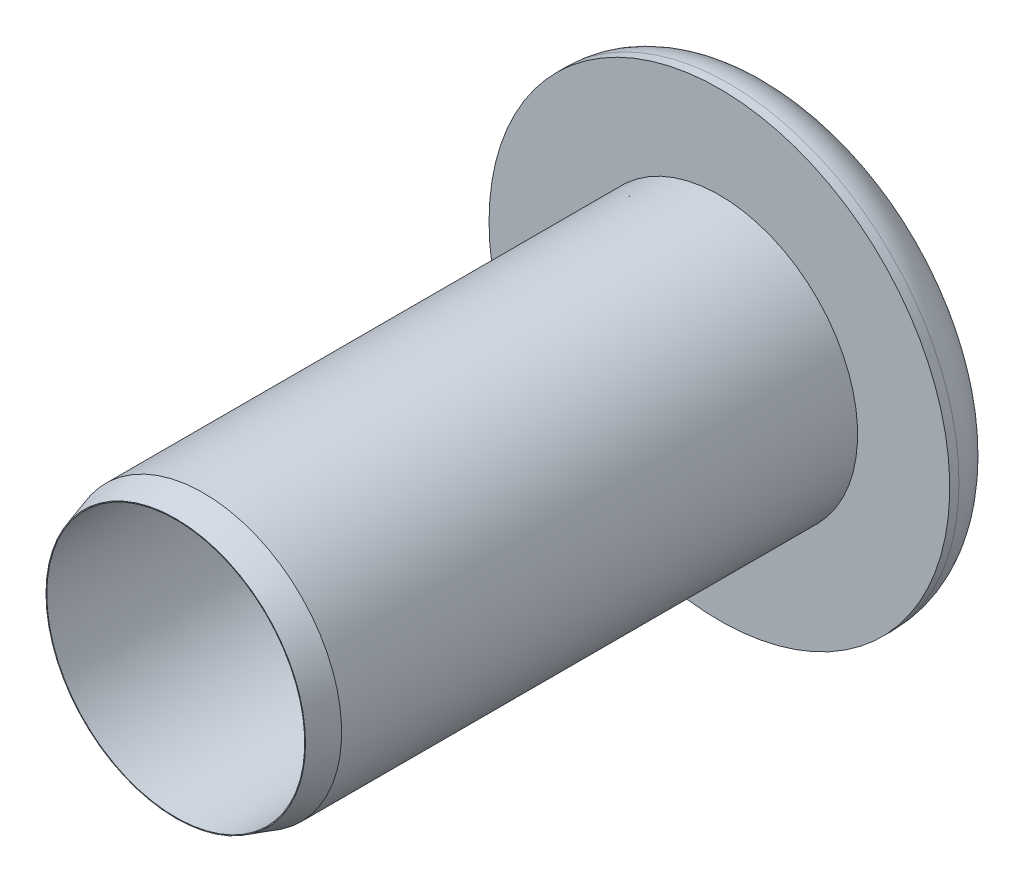
ISO-10303-21;
HEADER;
FILE_DESCRIPTION(('STEP AP214'),'2;1');
FILE_NAME('part.step','',(''),(''),'','','');
FILE_SCHEMA(('AUTOMOTIVE_DESIGN { 1 0 10303 214 1 1 1 1 }'));
ENDSEC;
DATA;
#1=APPLICATION_CONTEXT('core data for automotive mechanical design processes');
#2=APPLICATION_PROTOCOL_DEFINITION('international standard','automotive_design',2000,#1);
#3=PRODUCT_CONTEXT('',#1,'mechanical');
#4=PRODUCT('Part','Part','',(#3));
#5=PRODUCT_RELATED_PRODUCT_CATEGORY('part','',(#4));
#6=PRODUCT_DEFINITION_FORMATION('','',#4);
#7=PRODUCT_DEFINITION_CONTEXT('part definition',#1,'design');
#8=PRODUCT_DEFINITION('design','',#6,#7);
#9=PRODUCT_DEFINITION_SHAPE('','',#8);
#10=(LENGTH_UNIT() NAMED_UNIT(*) SI_UNIT(.MILLI.,.METRE.));
#11=(NAMED_UNIT(*) PLANE_ANGLE_UNIT() SI_UNIT($,.RADIAN.));
#12=(NAMED_UNIT(*) SI_UNIT($,.STERADIAN.) SOLID_ANGLE_UNIT());
#13=UNCERTAINTY_MEASURE_WITH_UNIT(LENGTH_MEASURE(1.E-05),#10,'distance_accuracy_value','');
#14=(GEOMETRIC_REPRESENTATION_CONTEXT(3) GLOBAL_UNCERTAINTY_ASSIGNED_CONTEXT((#13)) GLOBAL_UNIT_ASSIGNED_CONTEXT((#10,
#11,#12)) REPRESENTATION_CONTEXT('',''));
#15=CARTESIAN_POINT('',(0.,0.,0.));
#16=DIRECTION('',(0.,0.,1.));
#17=DIRECTION('',(1.,0.,0.));
#18=AXIS2_PLACEMENT_3D('',#15,#16,#17);
#19=CARTESIAN_POINT('',(0.,0.,6.5));
#20=DIRECTION('',(0.,0.,-1.));
#21=DIRECTION('',(-1.,0.,0.));
#22=AXIS2_PLACEMENT_3D('',#19,#20,#21);
#23=CYLINDRICAL_SURFACE('',#22,1.5);
#24=CARTESIAN_POINT('',(0.,0.,6.20000000000003));
#25=DIRECTION('',(0.,0.,1.));
#26=DIRECTION('',(1.,0.,0.));
#27=AXIS2_PLACEMENT_3D('',#24,#25,#26);
#28=CIRCLE('',#27,1.5);
#29=CARTESIAN_POINT('',(-1.5,0.,6.20000000000003));
#30=VERTEX_POINT('',#29);
#31=EDGE_CURVE('E10',#30,#30,#28,.F.);
#32=CARTESIAN_POINT('',(0.,0.,0.6));
#33=DIRECTION('',(0.,0.,-1.));
#34=DIRECTION('',(-1.,0.,0.));
#35=AXIS2_PLACEMENT_3D('',#32,#33,#34);
#36=CIRCLE('',#35,1.5);
#37=CARTESIAN_POINT('',(-1.5,0.,0.6));
#38=VERTEX_POINT('',#37);
#39=EDGE_CURVE('E57',#38,#38,#36,.T.);
#40=CARTESIAN_POINT('',(-1.5,0.,6.20000000000003));
#41=CARTESIAN_POINT('',(-1.5,0.,6.1416666666667));
#42=CARTESIAN_POINT('',(-1.5,0.,6.08333333333337));
#43=CARTESIAN_POINT('',(-1.5,0.,5.9666666666667));
#44=CARTESIAN_POINT('',(-1.5,0.,5.90833333333337));
#45=CARTESIAN_POINT('',(-1.5,0.,5.7916666666667));
#46=CARTESIAN_POINT('',(-1.5,0.,5.73333333333336));
#47=CARTESIAN_POINT('',(-1.5,0.,5.6166666666667));
#48=CARTESIAN_POINT('',(-1.5,0.,5.55833333333336));
#49=CARTESIAN_POINT('',(-1.5,0.,5.4416666666667));
#50=CARTESIAN_POINT('',(-1.5,0.,5.38333333333336));
#51=CARTESIAN_POINT('',(-1.5,0.,5.26666666666669));
#52=CARTESIAN_POINT('',(-1.5,0.,5.20833333333336));
#53=CARTESIAN_POINT('',(-1.5,0.,5.09166666666669));
#54=CARTESIAN_POINT('',(-1.5,0.,5.03333333333336));
#55=CARTESIAN_POINT('',(-1.5,0.,4.91666666666669));
#56=CARTESIAN_POINT('',(-1.5,0.,4.85833333333336));
#57=CARTESIAN_POINT('',(-1.5,0.,4.74166666666669));
#58=CARTESIAN_POINT('',(-1.5,0.,4.68333333333336));
#59=CARTESIAN_POINT('',(-1.5,0.,4.56666666666669));
#60=CARTESIAN_POINT('',(-1.5,0.,4.50833333333336));
#61=CARTESIAN_POINT('',(-1.5,0.,4.39166666666669));
#62=CARTESIAN_POINT('',(-1.5,0.,4.33333333333336));
#63=CARTESIAN_POINT('',(-1.5,0.,4.21666666666669));
#64=CARTESIAN_POINT('',(-1.5,0.,4.15833333333336));
#65=CARTESIAN_POINT('',(-1.5,0.,4.04166666666669));
#66=CARTESIAN_POINT('',(-1.5,0.,3.98333333333335));
#67=CARTESIAN_POINT('',(-1.5,0.,3.86666666666669));
#68=CARTESIAN_POINT('',(-1.5,0.,3.80833333333335));
#69=CARTESIAN_POINT('',(-1.5,0.,3.69166666666669));
#70=CARTESIAN_POINT('',(-1.5,0.,3.63333333333335));
#71=CARTESIAN_POINT('',(-1.5,0.,3.51666666666668));
#72=CARTESIAN_POINT('',(-1.5,0.,3.45833333333335));
#73=CARTESIAN_POINT('',(-1.5,0.,3.34166666666668));
#74=CARTESIAN_POINT('',(-1.5,0.,3.28333333333335));
#75=CARTESIAN_POINT('',(-1.5,0.,3.16666666666668));
#76=CARTESIAN_POINT('',(-1.5,0.,3.10833333333335));
#77=CARTESIAN_POINT('',(-1.5,0.,2.99166666666668));
#78=CARTESIAN_POINT('',(-1.5,0.,2.93333333333335));
#79=CARTESIAN_POINT('',(-1.5,0.,2.81666666666668));
#80=CARTESIAN_POINT('',(-1.5,0.,2.75833333333335));
#81=CARTESIAN_POINT('',(-1.5,0.,2.64166666666668));
#82=CARTESIAN_POINT('',(-1.5,0.,2.58333333333335));
#83=CARTESIAN_POINT('',(-1.5,0.,2.46666666666668));
#84=CARTESIAN_POINT('',(-1.5,0.,2.40833333333334));
#85=CARTESIAN_POINT('',(-1.5,0.,2.29166666666668));
#86=CARTESIAN_POINT('',(-1.5,0.,2.23333333333334));
#87=CARTESIAN_POINT('',(-1.5,0.,2.11666666666668));
#88=CARTESIAN_POINT('',(-1.5,0.,2.05833333333334));
#89=CARTESIAN_POINT('',(-1.5,0.,1.94166666666667));
#90=CARTESIAN_POINT('',(-1.5,0.,1.88333333333334));
#91=CARTESIAN_POINT('',(-1.5,0.,1.76666666666667));
#92=CARTESIAN_POINT('',(-1.5,0.,1.70833333333334));
#93=CARTESIAN_POINT('',(-1.5,0.,1.59166666666667));
#94=CARTESIAN_POINT('',(-1.5,0.,1.53333333333334));
#95=CARTESIAN_POINT('',(-1.5,0.,1.41666666666667));
#96=CARTESIAN_POINT('',(-1.5,0.,1.35833333333334));
#97=CARTESIAN_POINT('',(-1.5,0.,1.24166666666667));
#98=CARTESIAN_POINT('',(-1.5,0.,1.18333333333334));
#99=CARTESIAN_POINT('',(-1.5,0.,1.06666666666667));
#100=CARTESIAN_POINT('',(-1.5,0.,1.00833333333334));
#101=CARTESIAN_POINT('',(-1.5,0.,0.891666666666668));
#102=CARTESIAN_POINT('',(-1.5,0.,0.833333333333334));
#103=CARTESIAN_POINT('',(-1.5,0.,0.716666666666667));
#104=CARTESIAN_POINT('',(-1.5,0.,0.658333333333333));
#105=CARTESIAN_POINT('',(-1.5,0.,0.6));
#106=B_SPLINE_CURVE_WITH_KNOTS('',3,(#40,#41,#42,#43,#44,#45,#46,#47,#48,#49,#50,#51,#52,#53,
#54,#55,#56,#57,#58,#59,#60,#61,#62,#63,#64,#65,#66,#67,#68,#69,#70,#71,#72,#73,#74,#75,#76,#77,
#78,#79,#80,#81,#82,#83,#84,#85,#86,#87,#88,#89,#90,#91,#92,#93,#94,#95,#96,#97,#98,#99,#100,
#101,#102,#103,#104,#105),.UNSPECIFIED.,.F.,.F.,(4,2,2,2,2,2,2,2,2,2,2,2,2,2,2,2,2,2,2,2,2,2,2,
2,2,2,2,2,2,2,2,2,4),(0.,0.175000000000001,0.350000000000001,0.525000000000003,
0.700000000000004,0.875000000000005,1.05000000000001,1.22500000000001,1.40000000000001,
1.57500000000001,1.75000000000001,1.92500000000001,2.10000000000001,2.27500000000001,
2.45000000000001,2.62500000000002,2.80000000000002,2.97500000000002,3.15000000000002,
3.32500000000002,3.50000000000002,3.67500000000002,3.85000000000002,4.02500000000002,
4.20000000000002,4.37500000000003,4.55000000000003,4.72500000000003,4.90000000000003,
5.07500000000003,5.25000000000003,5.42500000000003,5.60000000000003),.UNSPECIFIED.);
#107=EDGE_CURVE('BSEAM31',#30,#38,#106,.T.);
#108=ORIENTED_EDGE('',*,*,#31,.T.);
#109=ORIENTED_EDGE('',*,*,#39,.F.);
#110=ORIENTED_EDGE('',*,*,#107,.T.);
#111=ORIENTED_EDGE('',*,*,#107,.F.);
#112=EDGE_LOOP('',(#108,#110,#109,#111));
#113=FACE_BOUND('',#112,.T.);
#114=ADVANCED_FACE('F31',(#113),#23,.T.);
#115=CARTESIAN_POINT('',(0.,0.,6.5));
#116=DIRECTION('',(0.,0.,1.));
#117=DIRECTION('',(1.,0.,0.));
#118=AXIS2_PLACEMENT_3D('',#115,#116,#117);
#119=PLANE('',#118);
#120=CARTESIAN_POINT('',(0.,0.,6.5));
#121=DIRECTION('',(0.,0.,1.));
#122=DIRECTION('',(1.,0.,0.));
#123=AXIS2_PLACEMENT_3D('',#120,#121,#122);
#124=CIRCLE('',#123,1.40828079556241);
#125=CARTESIAN_POINT('',(1.40828079556241,0.,6.5));
#126=VERTEX_POINT('',#125);
#127=EDGE_CURVE('E38',#126,#126,#124,.T.);
#128=ORIENTED_EDGE('',*,*,#127,.T.);
#129=EDGE_LOOP('',(#128));
#130=FACE_BOUND('',#129,.T.);
#131=CARTESIAN_POINT('',(0.,0.,6.5));
#132=DIRECTION('',(0.,0.,1.));
#133=DIRECTION('',(1.,0.,0.));
#134=AXIS2_PLACEMENT_3D('',#131,#132,#133);
#135=CIRCLE('',#134,1.4);
#136=CARTESIAN_POINT('',(-1.4,0.,6.5));
#137=VERTEX_POINT('',#136);
#138=EDGE_CURVE('E60',#137,#137,#135,.T.);
#139=ORIENTED_EDGE('',*,*,#138,.F.);
#140=EDGE_LOOP('',(#139));
#141=FACE_BOUND('',#140,.T.);
#142=ADVANCED_FACE('F85',(#130,#141),#119,.T.);
#143=CARTESIAN_POINT('',(0.,0.,0.));
#144=DIRECTION('',(0.,0.,1.));
#145=DIRECTION('',(1.,0.,0.));
#146=AXIS2_PLACEMENT_3D('',#143,#144,#145);
#147=PLANE('',#146);
#148=CARTESIAN_POINT('',(0.,0.,0.));
#149=DIRECTION('',(0.,0.,1.));
#150=DIRECTION('',(1.,0.,0.));
#151=AXIS2_PLACEMENT_3D('',#148,#149,#150);
#152=CIRCLE('',#151,1.9);
#153=CARTESIAN_POINT('',(1.9,0.,0.));
#154=VERTEX_POINT('',#153);
#155=EDGE_CURVE('E51',#154,#154,#152,.T.);
#156=ORIENTED_EDGE('',*,*,#155,.T.);
#157=EDGE_LOOP('',(#156));
#158=FACE_BOUND('',#157,.T.);
#159=CARTESIAN_POINT('',(0.,0.,0.));
#160=DIRECTION('',(0.,0.,1.));
#161=DIRECTION('',(1.,0.,0.));
#162=AXIS2_PLACEMENT_3D('',#159,#160,#161);
#163=CIRCLE('',#162,2.);
#164=CARTESIAN_POINT('',(2.,0.,0.));
#165=VERTEX_POINT('',#164);
#166=EDGE_CURVE('E54',#165,#165,#163,.F.);
#167=ORIENTED_EDGE('',*,*,#166,.T.);
#168=EDGE_LOOP('',(#167));
#169=FACE_BOUND('',#168,.T.);
#170=ADVANCED_FACE('F90',(#158,#169),#147,.F.);
#171=CARTESIAN_POINT('',(0.,0.,6.5));
#172=DIRECTION('',(0.,0.,-1.));
#173=DIRECTION('',(-1.,0.,0.));
#174=AXIS2_PLACEMENT_3D('',#171,#172,#173);
#175=CYLINDRICAL_SURFACE('',#174,1.4);
#176=CARTESIAN_POINT('',(0.,0.,0.5));
#177=DIRECTION('',(0.,0.,1.));
#178=DIRECTION('',(1.,0.,0.));
#179=AXIS2_PLACEMENT_3D('',#176,#177,#178);
#180=CIRCLE('',#179,1.4);
#181=CARTESIAN_POINT('',(-1.4,0.,0.499999999999999));
#182=VERTEX_POINT('',#181);
#183=EDGE_CURVE('E46',#182,#182,#180,.F.);
#184=CARTESIAN_POINT('',(-1.4,0.,0.499999999999999));
#185=CARTESIAN_POINT('',(-1.4,0.,0.562499999999999));
#186=CARTESIAN_POINT('',(-1.4,0.,0.624999999999999));
#187=CARTESIAN_POINT('',(-1.4,0.,0.749999999999999));
#188=CARTESIAN_POINT('',(-1.4,0.,0.812499999999999));
#189=CARTESIAN_POINT('',(-1.4,0.,0.937499999999999));
#190=CARTESIAN_POINT('',(-1.4,0.,0.999999999999999));
#191=CARTESIAN_POINT('',(-1.4,0.,1.125));
#192=CARTESIAN_POINT('',(-1.4,0.,1.1875));
#193=CARTESIAN_POINT('',(-1.4,0.,1.3125));
#194=CARTESIAN_POINT('',(-1.4,0.,1.375));
#195=CARTESIAN_POINT('',(-1.4,0.,1.5));
#196=CARTESIAN_POINT('',(-1.4,0.,1.5625));
#197=CARTESIAN_POINT('',(-1.4,0.,1.6875));
#198=CARTESIAN_POINT('',(-1.4,0.,1.75));
#199=CARTESIAN_POINT('',(-1.4,0.,1.875));
#200=CARTESIAN_POINT('',(-1.4,0.,1.9375));
#201=CARTESIAN_POINT('',(-1.4,0.,2.0625));
#202=CARTESIAN_POINT('',(-1.4,0.,2.125));
#203=CARTESIAN_POINT('',(-1.4,0.,2.25));
#204=CARTESIAN_POINT('',(-1.4,0.,2.3125));
#205=CARTESIAN_POINT('',(-1.4,0.,2.4375));
#206=CARTESIAN_POINT('',(-1.4,0.,2.5));
#207=CARTESIAN_POINT('',(-1.4,0.,2.625));
#208=CARTESIAN_POINT('',(-1.4,0.,2.6875));
#209=CARTESIAN_POINT('',(-1.4,0.,2.8125));
#210=CARTESIAN_POINT('',(-1.4,0.,2.875));
#211=CARTESIAN_POINT('',(-1.4,0.,3.));
#212=CARTESIAN_POINT('',(-1.4,0.,3.0625));
#213=CARTESIAN_POINT('',(-1.4,0.,3.1875));
#214=CARTESIAN_POINT('',(-1.4,0.,3.25));
#215=CARTESIAN_POINT('',(-1.4,0.,3.375));
#216=CARTESIAN_POINT('',(-1.4,0.,3.4375));
#217=CARTESIAN_POINT('',(-1.4,0.,3.5625));
#218=CARTESIAN_POINT('',(-1.4,0.,3.625));
#219=CARTESIAN_POINT('',(-1.4,0.,3.75));
#220=CARTESIAN_POINT('',(-1.4,0.,3.8125));
#221=CARTESIAN_POINT('',(-1.4,0.,3.9375));
#222=CARTESIAN_POINT('',(-1.4,0.,4.));
#223=CARTESIAN_POINT('',(-1.4,0.,4.125));
#224=CARTESIAN_POINT('',(-1.4,0.,4.1875));
#225=CARTESIAN_POINT('',(-1.4,0.,4.3125));
#226=CARTESIAN_POINT('',(-1.4,0.,4.375));
#227=CARTESIAN_POINT('',(-1.4,0.,4.5));
#228=CARTESIAN_POINT('',(-1.4,0.,4.5625));
#229=CARTESIAN_POINT('',(-1.4,0.,4.6875));
#230=CARTESIAN_POINT('',(-1.4,0.,4.75));
#231=CARTESIAN_POINT('',(-1.4,0.,4.875));
#232=CARTESIAN_POINT('',(-1.4,0.,4.9375));
#233=CARTESIAN_POINT('',(-1.4,0.,5.0625));
#234=CARTESIAN_POINT('',(-1.4,0.,5.125));
#235=CARTESIAN_POINT('',(-1.4,0.,5.25));
#236=CARTESIAN_POINT('',(-1.4,0.,5.3125));
#237=CARTESIAN_POINT('',(-1.4,0.,5.4375));
#238=CARTESIAN_POINT('',(-1.4,0.,5.5));
#239=CARTESIAN_POINT('',(-1.4,0.,5.625));
#240=CARTESIAN_POINT('',(-1.4,0.,5.6875));
#241=CARTESIAN_POINT('',(-1.4,0.,5.8125));
#242=CARTESIAN_POINT('',(-1.4,0.,5.875));
#243=CARTESIAN_POINT('',(-1.4,0.,6.));
#244=CARTESIAN_POINT('',(-1.4,0.,6.0625));
#245=CARTESIAN_POINT('',(-1.4,0.,6.1875));
#246=CARTESIAN_POINT('',(-1.4,0.,6.25));
#247=CARTESIAN_POINT('',(-1.4,0.,6.375));
#248=CARTESIAN_POINT('',(-1.4,0.,6.4375));
#249=CARTESIAN_POINT('',(-1.4,0.,6.5));
#250=B_SPLINE_CURVE_WITH_KNOTS('',3,(#184,#185,#186,#187,#188,#189,#190,#191,#192,#193,#194,
#195,#196,#197,#198,#199,#200,#201,#202,#203,#204,#205,#206,#207,#208,#209,#210,#211,#212,#213,
#214,#215,#216,#217,#218,#219,#220,#221,#222,#223,#224,#225,#226,#227,#228,#229,#230,#231,#232,
#233,#234,#235,#236,#237,#238,#239,#240,#241,#242,#243,#244,#245,#246,#247,#248,#249),
.UNSPECIFIED.,.F.,.F.,(4,2,2,2,2,2,2,2,2,2,2,2,2,2,2,2,2,2,2,2,2,2,2,2,2,2,2,2,2,2,2,2,4),(0.,
0.1875,0.375,0.5625,0.750000000000001,0.9375,1.125,1.3125,1.5,1.6875,1.875,2.0625,2.25,2.4375,
2.625,2.8125,3.,3.1875,3.375,3.5625,3.75,3.9375,4.125,4.3125,4.5,4.6875,4.875,5.0625,5.25,
5.4375,5.625,5.8125,6.),.UNSPECIFIED.);
#251=EDGE_CURVE('BSEAM81',#182,#137,#250,.T.);
#252=ORIENTED_EDGE('',*,*,#183,.T.);
#253=ORIENTED_EDGE('',*,*,#138,.T.);
#254=ORIENTED_EDGE('',*,*,#251,.T.);
#255=ORIENTED_EDGE('',*,*,#251,.F.);
#256=EDGE_LOOP('',(#252,#254,#253,#255));
#257=FACE_BOUND('',#256,.T.);
#258=ADVANCED_FACE('F81',(#257),#175,.F.);
#259=CARTESIAN_POINT('',(0.,0.,0.6));
#260=DIRECTION('',(0.,0.,-1.));
#261=DIRECTION('',(-1.,0.,0.));
#262=AXIS2_PLACEMENT_3D('',#259,#260,#261);
#263=CYLINDRICAL_SURFACE('',#262,2.5);
#264=CARTESIAN_POINT('',(0.,0.,0.5));
#265=DIRECTION('',(0.,0.,1.));
#266=DIRECTION('',(1.,0.,0.));
#267=AXIS2_PLACEMENT_3D('',#264,#265,#266);
#268=CIRCLE('',#267,2.5);
#269=CARTESIAN_POINT('',(2.5,0.,0.5));
#270=VERTEX_POINT('',#269);
#271=EDGE_CURVE('E42',#270,#270,#268,.T.);
#272=ORIENTED_EDGE('',*,*,#271,.T.);
#273=EDGE_LOOP('',(#272));
#274=FACE_BOUND('',#273,.T.);
#275=CARTESIAN_POINT('',(0.,0.,0.6));
#276=DIRECTION('',(0.,0.,-1.));
#277=DIRECTION('',(-1.,0.,0.));
#278=AXIS2_PLACEMENT_3D('',#275,#276,#277);
#279=CIRCLE('',#278,2.5);
#280=CARTESIAN_POINT('',(-2.5,0.,0.6));
#281=VERTEX_POINT('',#280);
#282=EDGE_CURVE('E63',#281,#281,#279,.T.);
#283=ORIENTED_EDGE('',*,*,#282,.T.);
#284=EDGE_LOOP('',(#283));
#285=FACE_BOUND('',#284,.T.);
#286=ADVANCED_FACE('F67',(#274,#285),#263,.T.);
#287=CARTESIAN_POINT('',(0.,0.,0.6));
#288=DIRECTION('',(0.,0.,-1.));
#289=DIRECTION('',(-1.,0.,0.));
#290=AXIS2_PLACEMENT_3D('',#287,#288,#289);
#291=PLANE('',#290);
#292=ORIENTED_EDGE('',*,*,#39,.T.);
#293=EDGE_LOOP('',(#292));
#294=FACE_BOUND('',#293,.T.);
#295=ORIENTED_EDGE('',*,*,#282,.F.);
#296=EDGE_LOOP('',(#295));
#297=FACE_BOUND('',#296,.T.);
#298=ADVANCED_FACE('F69',(#294,#297),#291,.F.);
#299=CARTESIAN_POINT('',(0.,0.,0.5));
#300=DIRECTION('',(0.,0.,1.));
#301=DIRECTION('',(1.,0.,0.));
#302=AXIS2_PLACEMENT_3D('',#299,#300,#301);
#303=TOROIDAL_SURFACE('',#302,1.9,0.5);
#304=ORIENTED_EDGE('',*,*,#183,.F.);
#305=EDGE_LOOP('',(#304));
#306=FACE_BOUND('',#305,.T.);
#307=ORIENTED_EDGE('',*,*,#155,.F.);
#308=EDGE_LOOP('',(#307));
#309=FACE_BOUND('',#308,.T.);
#310=ADVANCED_FACE('F71',(#306,#309),#303,.T.);
#311=CARTESIAN_POINT('',(0.,0.,0.5));
#312=DIRECTION('',(0.,0.,1.));
#313=DIRECTION('',(1.,0.,0.));
#314=AXIS2_PLACEMENT_3D('',#311,#312,#313);
#315=TOROIDAL_SURFACE('',#314,2.,0.5);
#316=ORIENTED_EDGE('',*,*,#271,.F.);
#317=EDGE_LOOP('',(#316));
#318=FACE_BOUND('',#317,.T.);
#319=ORIENTED_EDGE('',*,*,#166,.F.);
#320=EDGE_LOOP('',(#319));
#321=FACE_BOUND('',#320,.T.);
#322=ADVANCED_FACE('F78',(#318,#321),#315,.T.);
#323=CARTESIAN_POINT('',(0.,0.,6.5));
#324=DIRECTION('',(0.,0.,-1.));
#325=DIRECTION('',(-1.,0.,0.));
#326=AXIS2_PLACEMENT_3D('',#323,#324,#325);
#327=CONICAL_SURFACE('',#326,1.40828079556241,0.296705972839034);
#328=ORIENTED_EDGE('',*,*,#31,.F.);
#329=EDGE_LOOP('',(#328));
#330=FACE_BOUND('',#329,.T.);
#331=ORIENTED_EDGE('',*,*,#127,.F.);
#332=EDGE_LOOP('',(#331));
#333=FACE_BOUND('',#332,.T.);
#334=ADVANCED_FACE('F33',(#330,#333),#327,.T.);
#335=CLOSED_SHELL('',(#114,#142,#170,#258,#286,#298,#310,#322,#334));
#336=MANIFOLD_SOLID_BREP('B2',#335);
#337=ADVANCED_BREP_SHAPE_REPRESENTATION('',(#18,#336),#14);
#338=SHAPE_DEFINITION_REPRESENTATION(#9,#337);
ENDSEC;
END-ISO-10303-21;
